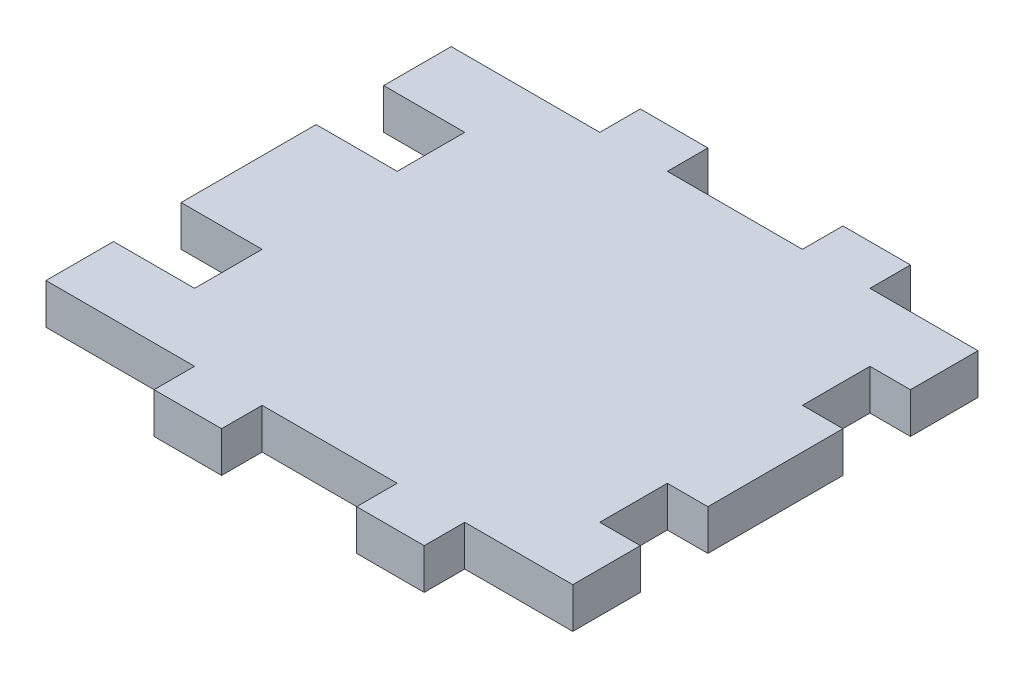
ISO-10303-21;
HEADER;
FILE_DESCRIPTION(('STEP AP214'),'2;1');
FILE_NAME('part.step','',(''),(''),'','','');
FILE_SCHEMA(('AUTOMOTIVE_DESIGN { 1 0 10303 214 1 1 1 1 }'));
ENDSEC;
DATA;
#1=APPLICATION_CONTEXT('core data for automotive mechanical design processes');
#2=APPLICATION_PROTOCOL_DEFINITION('international standard','automotive_design',2000,#1);
#3=PRODUCT_CONTEXT('',#1,'mechanical');
#4=PRODUCT('Part','Part','',(#3));
#5=PRODUCT_RELATED_PRODUCT_CATEGORY('part','',(#4));
#6=PRODUCT_DEFINITION_FORMATION('','',#4);
#7=PRODUCT_DEFINITION_CONTEXT('part definition',#1,'design');
#8=PRODUCT_DEFINITION('design','',#6,#7);
#9=PRODUCT_DEFINITION_SHAPE('','',#8);
#10=(LENGTH_UNIT() NAMED_UNIT(*) SI_UNIT(.MILLI.,.METRE.));
#11=(NAMED_UNIT(*) PLANE_ANGLE_UNIT() SI_UNIT($,.RADIAN.));
#12=(NAMED_UNIT(*) SI_UNIT($,.STERADIAN.) SOLID_ANGLE_UNIT());
#13=UNCERTAINTY_MEASURE_WITH_UNIT(LENGTH_MEASURE(1.E-05),#10,'distance_accuracy_value','');
#14=(GEOMETRIC_REPRESENTATION_CONTEXT(3) GLOBAL_UNCERTAINTY_ASSIGNED_CONTEXT((#13)) GLOBAL_UNIT_ASSIGNED_CONTEXT((#10,
#11,#12)) REPRESENTATION_CONTEXT('',''));
#15=CARTESIAN_POINT('',(0.,0.,0.));
#16=DIRECTION('',(0.,0.,1.));
#17=DIRECTION('',(1.,0.,0.));
#18=AXIS2_PLACEMENT_3D('',#15,#16,#17);
#19=CARTESIAN_POINT('',(30.,6.,0.));
#20=DIRECTION('',(1.,0.,0.));
#21=DIRECTION('',(0.,0.,-1.));
#22=AXIS2_PLACEMENT_3D('',#19,#20,#21);
#23=PLANE('',#22);
#24=DIRECTION('',(0.,0.,1.));
#25=VECTOR('',#24,1.);
#26=CARTESIAN_POINT('',(30.,0.,0.));
#27=LINE('',#26,#25);
#28=CARTESIAN_POINT('',(30.,0.,-20.));
#29=VERTEX_POINT('',#28);
#30=CARTESIAN_POINT('',(30.,0.,-10.));
#31=VERTEX_POINT('',#30);
#32=EDGE_CURVE('E300',#29,#31,#27,.T.);
#33=ORIENTED_EDGE('',*,*,#32,.F.);
#34=DIRECTION('',(0.,-1.,0.));
#35=VECTOR('',#34,1.);
#36=CARTESIAN_POINT('',(30.,6.,-20.));
#37=LINE('',#36,#35);
#38=CARTESIAN_POINT('',(30.,6.,-20.));
#39=VERTEX_POINT('',#38);
#40=EDGE_CURVE('E11',#39,#29,#37,.T.);
#41=ORIENTED_EDGE('',*,*,#40,.F.);
#42=DIRECTION('',(0.,0.,1.));
#43=VECTOR('',#42,1.);
#44=CARTESIAN_POINT('',(30.,6.,0.));
#45=LINE('',#44,#43);
#46=CARTESIAN_POINT('',(30.,6.,-10.));
#47=VERTEX_POINT('',#46);
#48=EDGE_CURVE('E387',#39,#47,#45,.T.);
#49=ORIENTED_EDGE('',*,*,#48,.T.);
#50=DIRECTION('',(0.,-1.,0.));
#51=VECTOR('',#50,1.);
#52=CARTESIAN_POINT('',(30.,6.,-10.));
#53=LINE('',#52,#51);
#54=EDGE_CURVE('E54',#47,#31,#53,.T.);
#55=ORIENTED_EDGE('',*,*,#54,.T.);
#56=EDGE_LOOP('',(#33,#41,#49,#55));
#57=FACE_BOUND('',#56,.T.);
#58=ADVANCED_FACE('F37',(#57),#23,.T.);
#59=CARTESIAN_POINT('',(0.,6.,-20.));
#60=DIRECTION('',(0.,0.,-1.));
#61=DIRECTION('',(-1.,0.,0.));
#62=AXIS2_PLACEMENT_3D('',#59,#60,#61);
#63=PLANE('',#62);
#64=DIRECTION('',(1.,0.,0.));
#65=VECTOR('',#64,1.);
#66=CARTESIAN_POINT('',(0.,0.,-20.));
#67=LINE('',#66,#65);
#68=CARTESIAN_POINT('',(36.,0.,-20.));
#69=VERTEX_POINT('',#68);
#70=EDGE_CURVE('E302',#29,#69,#67,.T.);
#71=ORIENTED_EDGE('',*,*,#70,.T.);
#72=DIRECTION('',(0.,-1.,0.));
#73=VECTOR('',#72,1.);
#74=CARTESIAN_POINT('',(36.,6.,-20.));
#75=LINE('',#74,#73);
#76=CARTESIAN_POINT('',(36.,6.,-20.));
#77=VERTEX_POINT('',#76);
#78=EDGE_CURVE('E46',#77,#69,#75,.T.);
#79=ORIENTED_EDGE('',*,*,#78,.F.);
#80=DIRECTION('',(1.,0.,0.));
#81=VECTOR('',#80,1.);
#82=CARTESIAN_POINT('',(0.,6.,-20.));
#83=LINE('',#82,#81);
#84=EDGE_CURVE('E478',#39,#77,#83,.T.);
#85=ORIENTED_EDGE('',*,*,#84,.F.);
#86=ORIENTED_EDGE('',*,*,#40,.T.);
#87=EDGE_LOOP('',(#71,#79,#85,#86));
#88=FACE_BOUND('',#87,.T.);
#89=ADVANCED_FACE('F39',(#88),#63,.F.);
#90=CARTESIAN_POINT('',(36.,6.,0.));
#91=DIRECTION('',(1.,0.,0.));
#92=DIRECTION('',(0.,0.,-1.));
#93=AXIS2_PLACEMENT_3D('',#90,#91,#92);
#94=PLANE('',#93);
#95=DIRECTION('',(0.,0.,1.));
#96=VECTOR('',#95,1.);
#97=CARTESIAN_POINT('',(36.,0.,0.));
#98=LINE('',#97,#96);
#99=CARTESIAN_POINT('',(36.,0.,-30.));
#100=VERTEX_POINT('',#99);
#101=EDGE_CURVE('E306',#100,#69,#98,.T.);
#102=ORIENTED_EDGE('',*,*,#101,.F.);
#103=DIRECTION('',(0.,-1.,0.));
#104=VECTOR('',#103,1.);
#105=CARTESIAN_POINT('',(36.,6.,-30.));
#106=LINE('',#105,#104);
#107=CARTESIAN_POINT('',(36.,6.,-30.));
#108=VERTEX_POINT('',#107);
#109=EDGE_CURVE('E457',#108,#100,#106,.T.);
#110=ORIENTED_EDGE('',*,*,#109,.F.);
#111=DIRECTION('',(0.,0.,1.));
#112=VECTOR('',#111,1.);
#113=CARTESIAN_POINT('',(36.,6.,0.));
#114=LINE('',#113,#112);
#115=EDGE_CURVE('E464',#108,#77,#114,.T.);
#116=ORIENTED_EDGE('',*,*,#115,.T.);
#117=ORIENTED_EDGE('',*,*,#78,.T.);
#118=EDGE_LOOP('',(#102,#110,#116,#117));
#119=FACE_BOUND('',#118,.T.);
#120=ADVANCED_FACE('F462',(#119),#94,.T.);
#121=CARTESIAN_POINT('',(0.,6.,-30.));
#122=DIRECTION('',(0.,0.,-1.));
#123=DIRECTION('',(-1.,0.,0.));
#124=AXIS2_PLACEMENT_3D('',#121,#122,#123);
#125=PLANE('',#124);
#126=DIRECTION('',(1.,0.,0.));
#127=VECTOR('',#126,1.);
#128=CARTESIAN_POINT('',(0.,0.,-30.));
#129=LINE('',#128,#127);
#130=CARTESIAN_POINT('',(20.0000000000002,0.,-30.));
#131=VERTEX_POINT('',#130);
#132=EDGE_CURVE('E309',#131,#100,#129,.T.);
#133=ORIENTED_EDGE('',*,*,#132,.F.);
#134=DIRECTION('',(0.,-1.,0.));
#135=VECTOR('',#134,1.);
#136=CARTESIAN_POINT('',(20.0000000000002,6.,-30.));
#137=LINE('',#136,#135);
#138=CARTESIAN_POINT('',(20.0000000000002,6.,-30.));
#139=VERTEX_POINT('',#138);
#140=EDGE_CURVE('E455',#139,#131,#137,.T.);
#141=ORIENTED_EDGE('',*,*,#140,.F.);
#142=DIRECTION('',(1.,0.,0.));
#143=VECTOR('',#142,1.);
#144=CARTESIAN_POINT('',(0.,6.,-30.));
#145=LINE('',#144,#143);
#146=EDGE_CURVE('E477',#139,#108,#145,.T.);
#147=ORIENTED_EDGE('',*,*,#146,.T.);
#148=ORIENTED_EDGE('',*,*,#109,.T.);
#149=EDGE_LOOP('',(#133,#141,#147,#148));
#150=FACE_BOUND('',#149,.T.);
#151=ADVANCED_FACE('F473',(#150),#125,.T.);
#152=CARTESIAN_POINT('',(19.9999999999992,6.,6.93889390390704E-13));
#153=DIRECTION('',(-1.,0.,0.));
#154=DIRECTION('',(0.,0.,1.));
#155=AXIS2_PLACEMENT_3D('',#152,#153,#154);
#156=PLANE('',#155);
#157=DIRECTION('',(0.,0.,-1.));
#158=VECTOR('',#157,1.);
#159=CARTESIAN_POINT('',(19.9999999999992,0.,6.93889390390704E-13));
#160=LINE('',#159,#158);
#161=CARTESIAN_POINT('',(20.0000000000004,0.,-35.9999999999998));
#162=VERTEX_POINT('',#161);
#163=EDGE_CURVE('E312',#131,#162,#160,.T.);
#164=ORIENTED_EDGE('',*,*,#163,.T.);
#165=DIRECTION('',(0.,-1.,0.));
#166=VECTOR('',#165,1.);
#167=CARTESIAN_POINT('',(20.0000000000004,6.,-35.9999999999998));
#168=LINE('',#167,#166);
#169=CARTESIAN_POINT('',(20.0000000000004,6.,-35.9999999999998));
#170=VERTEX_POINT('',#169);
#171=EDGE_CURVE('E452',#170,#162,#168,.T.);
#172=ORIENTED_EDGE('',*,*,#171,.F.);
#173=DIRECTION('',(0.,0.,-1.));
#174=VECTOR('',#173,1.);
#175=CARTESIAN_POINT('',(19.9999999999992,6.,6.93889390390704E-13));
#176=LINE('',#175,#174);
#177=EDGE_CURVE('E480',#139,#170,#176,.T.);
#178=ORIENTED_EDGE('',*,*,#177,.F.);
#179=ORIENTED_EDGE('',*,*,#140,.T.);
#180=EDGE_LOOP('',(#164,#172,#178,#179));
#181=FACE_BOUND('',#180,.T.);
#182=ADVANCED_FACE('F683',(#181),#156,.F.);
#183=CARTESIAN_POINT('',(0.,6.,-35.9999999999998));
#184=DIRECTION('',(0.,0.,1.));
#185=DIRECTION('',(1.,0.,0.));
#186=AXIS2_PLACEMENT_3D('',#183,#184,#185);
#187=PLANE('',#186);
#188=DIRECTION('',(-1.,0.,0.));
#189=VECTOR('',#188,1.);
#190=CARTESIAN_POINT('',(0.,0.,-35.9999999999998));
#191=LINE('',#190,#189);
#192=CARTESIAN_POINT('',(10.0000000000004,0.,-35.9999999999998));
#193=VERTEX_POINT('',#192);
#194=EDGE_CURVE('E316',#162,#193,#191,.T.);
#195=ORIENTED_EDGE('',*,*,#194,.T.);
#196=DIRECTION('',(0.,-1.,0.));
#197=VECTOR('',#196,1.);
#198=CARTESIAN_POINT('',(10.0000000000004,6.,-35.9999999999998));
#199=LINE('',#198,#197);
#200=CARTESIAN_POINT('',(10.0000000000004,6.,-35.9999999999998));
#201=VERTEX_POINT('',#200);
#202=EDGE_CURVE('E450',#201,#193,#199,.T.);
#203=ORIENTED_EDGE('',*,*,#202,.F.);
#204=DIRECTION('',(-1.,0.,0.));
#205=VECTOR('',#204,1.);
#206=CARTESIAN_POINT('',(0.,6.,-35.9999999999998));
#207=LINE('',#206,#205);
#208=EDGE_CURVE('E488',#170,#201,#207,.T.);
#209=ORIENTED_EDGE('',*,*,#208,.F.);
#210=ORIENTED_EDGE('',*,*,#171,.T.);
#211=EDGE_LOOP('',(#195,#203,#209,#210));
#212=FACE_BOUND('',#211,.T.);
#213=ADVANCED_FACE('F679',(#212),#187,.F.);
#214=CARTESIAN_POINT('',(9.99999999999917,6.,3.44053489402047E-13));
#215=DIRECTION('',(-1.,0.,0.));
#216=DIRECTION('',(0.,0.,1.));
#217=AXIS2_PLACEMENT_3D('',#214,#215,#216);
#218=PLANE('',#217);
#219=DIRECTION('',(0.,0.,-1.));
#220=VECTOR('',#219,1.);
#221=CARTESIAN_POINT('',(9.99999999999917,0.,3.44053489402047E-13));
#222=LINE('',#221,#220);
#223=CARTESIAN_POINT('',(10.0000000000002,0.,-30.));
#224=VERTEX_POINT('',#223);
#225=EDGE_CURVE('E319',#224,#193,#222,.T.);
#226=ORIENTED_EDGE('',*,*,#225,.F.);
#227=DIRECTION('',(0.,-1.,0.));
#228=VECTOR('',#227,1.);
#229=CARTESIAN_POINT('',(10.0000000000002,6.,-30.));
#230=LINE('',#229,#228);
#231=CARTESIAN_POINT('',(10.0000000000002,6.,-30.));
#232=VERTEX_POINT('',#231);
#233=EDGE_CURVE('E448',#232,#224,#230,.T.);
#234=ORIENTED_EDGE('',*,*,#233,.F.);
#235=DIRECTION('',(0.,0.,-1.));
#236=VECTOR('',#235,1.);
#237=CARTESIAN_POINT('',(9.99999999999917,6.,3.44053489402047E-13));
#238=LINE('',#237,#236);
#239=EDGE_CURVE('E490',#232,#201,#238,.T.);
#240=ORIENTED_EDGE('',*,*,#239,.T.);
#241=ORIENTED_EDGE('',*,*,#202,.T.);
#242=EDGE_LOOP('',(#226,#234,#240,#241));
#243=FACE_BOUND('',#242,.T.);
#244=ADVANCED_FACE('F676',(#243),#218,.T.);
#245=CARTESIAN_POINT('',(-9.99999999999969,0.,-30.));
#246=VERTEX_POINT('',#245);
#247=EDGE_CURVE('E314',#246,#224,#129,.T.);
#248=ORIENTED_EDGE('',*,*,#247,.F.);
#249=DIRECTION('',(0.,-1.,0.));
#250=VECTOR('',#249,1.);
#251=CARTESIAN_POINT('',(-9.99999999999969,6.,-30.));
#252=LINE('',#251,#250);
#253=CARTESIAN_POINT('',(-9.99999999999969,6.,-30.));
#254=VERTEX_POINT('',#253);
#255=EDGE_CURVE('E446',#254,#246,#252,.T.);
#256=ORIENTED_EDGE('',*,*,#255,.F.);
#257=EDGE_CURVE('E483',#254,#232,#145,.T.);
#258=ORIENTED_EDGE('',*,*,#257,.T.);
#259=ORIENTED_EDGE('',*,*,#233,.T.);
#260=EDGE_LOOP('',(#248,#256,#258,#259));
#261=FACE_BOUND('',#260,.T.);
#262=ADVANCED_FACE('F664',(#261),#125,.T.);
#263=CARTESIAN_POINT('',(-10.0000000000007,6.,-3.15141431469159E-13));
#264=DIRECTION('',(-1.,0.,0.));
#265=DIRECTION('',(0.,0.,1.));
#266=AXIS2_PLACEMENT_3D('',#263,#264,#265);
#267=PLANE('',#266);
#268=DIRECTION('',(0.,0.,-1.));
#269=VECTOR('',#268,1.);
#270=CARTESIAN_POINT('',(-10.0000000000007,0.,-3.15141431469159E-13));
#271=LINE('',#270,#269);
#272=CARTESIAN_POINT('',(-9.9999999999996,0.,-35.9999999999998));
#273=VERTEX_POINT('',#272);
#274=EDGE_CURVE('E322',#246,#273,#271,.T.);
#275=ORIENTED_EDGE('',*,*,#274,.T.);
#276=DIRECTION('',(0.,-1.,0.));
#277=VECTOR('',#276,1.);
#278=CARTESIAN_POINT('',(-9.9999999999996,6.,-35.9999999999998));
#279=LINE('',#278,#277);
#280=CARTESIAN_POINT('',(-9.9999999999996,6.,-35.9999999999998));
#281=VERTEX_POINT('',#280);
#282=EDGE_CURVE('E444',#281,#273,#279,.T.);
#283=ORIENTED_EDGE('',*,*,#282,.F.);
#284=DIRECTION('',(0.,0.,-1.));
#285=VECTOR('',#284,1.);
#286=CARTESIAN_POINT('',(-10.0000000000007,6.,-3.15141431469159E-13));
#287=LINE('',#286,#285);
#288=EDGE_CURVE('E493',#254,#281,#287,.T.);
#289=ORIENTED_EDGE('',*,*,#288,.F.);
#290=ORIENTED_EDGE('',*,*,#255,.T.);
#291=EDGE_LOOP('',(#275,#283,#289,#290));
#292=FACE_BOUND('',#291,.T.);
#293=ADVANCED_FACE('F671',(#292),#267,.F.);
#294=CARTESIAN_POINT('',(0.,6.,-35.9999999999998));
#295=DIRECTION('',(0.,0.,-1.));
#296=DIRECTION('',(-1.,0.,0.));
#297=AXIS2_PLACEMENT_3D('',#294,#295,#296);
#298=PLANE('',#297);
#299=DIRECTION('',(1.,0.,0.));
#300=VECTOR('',#299,1.);
#301=CARTESIAN_POINT('',(0.,0.,-35.9999999999998));
#302=LINE('',#301,#300);
#303=CARTESIAN_POINT('',(-19.9999999999996,0.,-35.9999999999998));
#304=VERTEX_POINT('',#303);
#305=EDGE_CURVE('E325',#304,#273,#302,.T.);
#306=ORIENTED_EDGE('',*,*,#305,.F.);
#307=DIRECTION('',(0.,-1.,0.));
#308=VECTOR('',#307,1.);
#309=CARTESIAN_POINT('',(-19.9999999999996,6.,-35.9999999999998));
#310=LINE('',#309,#308);
#311=CARTESIAN_POINT('',(-19.9999999999996,6.,-35.9999999999998));
#312=VERTEX_POINT('',#311);
#313=EDGE_CURVE('E442',#312,#304,#310,.T.);
#314=ORIENTED_EDGE('',*,*,#313,.F.);
#315=DIRECTION('',(1.,0.,0.));
#316=VECTOR('',#315,1.);
#317=CARTESIAN_POINT('',(0.,6.,-35.9999999999998));
#318=LINE('',#317,#316);
#319=EDGE_CURVE('E495',#312,#281,#318,.T.);
#320=ORIENTED_EDGE('',*,*,#319,.T.);
#321=ORIENTED_EDGE('',*,*,#282,.T.);
#322=EDGE_LOOP('',(#306,#314,#320,#321));
#323=FACE_BOUND('',#322,.T.);
#324=ADVANCED_FACE('F667',(#323),#298,.T.);
#325=CARTESIAN_POINT('',(-20.0000000000008,6.,-6.47630097698073E-13));
#326=DIRECTION('',(-1.,0.,0.));
#327=DIRECTION('',(0.,0.,1.));
#328=AXIS2_PLACEMENT_3D('',#325,#326,#327);
#329=PLANE('',#328);
#330=DIRECTION('',(0.,0.,-1.));
#331=VECTOR('',#330,1.);
#332=CARTESIAN_POINT('',(-20.0000000000008,0.,-6.47630097698073E-13));
#333=LINE('',#332,#331);
#334=CARTESIAN_POINT('',(-19.9999999999997,0.,-30.));
#335=VERTEX_POINT('',#334);
#336=EDGE_CURVE('E328',#335,#304,#333,.T.);
#337=ORIENTED_EDGE('',*,*,#336,.F.);
#338=DIRECTION('',(0.,-1.,0.));
#339=VECTOR('',#338,1.);
#340=CARTESIAN_POINT('',(-19.9999999999997,6.,-30.));
#341=LINE('',#340,#339);
#342=CARTESIAN_POINT('',(-19.9999999999997,6.,-30.));
#343=VERTEX_POINT('',#342);
#344=EDGE_CURVE('E440',#343,#335,#341,.T.);
#345=ORIENTED_EDGE('',*,*,#344,.F.);
#346=DIRECTION('',(0.,0.,-1.));
#347=VECTOR('',#346,1.);
#348=CARTESIAN_POINT('',(-20.0000000000008,6.,-6.47630097698073E-13));
#349=LINE('',#348,#347);
#350=EDGE_CURVE('E498',#343,#312,#349,.T.);
#351=ORIENTED_EDGE('',*,*,#350,.T.);
#352=ORIENTED_EDGE('',*,*,#313,.T.);
#353=EDGE_LOOP('',(#337,#345,#351,#352));
#354=FACE_BOUND('',#353,.T.);
#355=ADVANCED_FACE('F662',(#354),#329,.T.);
#356=CARTESIAN_POINT('',(-42.,0.,-30.));
#357=VERTEX_POINT('',#356);
#358=EDGE_CURVE('E313',#357,#335,#129,.T.);
#359=ORIENTED_EDGE('',*,*,#358,.F.);
#360=DIRECTION('',(0.,-1.,0.));
#361=VECTOR('',#360,1.);
#362=CARTESIAN_POINT('',(-42.,6.,-30.));
#363=LINE('',#362,#361);
#364=CARTESIAN_POINT('',(-42.,6.,-30.));
#365=VERTEX_POINT('',#364);
#366=EDGE_CURVE('E438',#365,#357,#363,.T.);
#367=ORIENTED_EDGE('',*,*,#366,.F.);
#368=EDGE_CURVE('E482',#365,#343,#145,.T.);
#369=ORIENTED_EDGE('',*,*,#368,.T.);
#370=ORIENTED_EDGE('',*,*,#344,.T.);
#371=EDGE_LOOP('',(#359,#367,#369,#370));
#372=FACE_BOUND('',#371,.T.);
#373=ADVANCED_FACE('F658',(#372),#125,.T.);
#374=CARTESIAN_POINT('',(-42.,6.,0.));
#375=DIRECTION('',(1.,0.,0.));
#376=DIRECTION('',(0.,0.,-1.));
#377=AXIS2_PLACEMENT_3D('',#374,#375,#376);
#378=PLANE('',#377);
#379=DIRECTION('',(0.,0.,1.));
#380=VECTOR('',#379,1.);
#381=CARTESIAN_POINT('',(-42.,0.,0.));
#382=LINE('',#381,#380);
#383=CARTESIAN_POINT('',(-42.,0.,-20.));
#384=VERTEX_POINT('',#383);
#385=EDGE_CURVE('E331',#357,#384,#382,.T.);
#386=ORIENTED_EDGE('',*,*,#385,.T.);
#387=DIRECTION('',(0.,-1.,0.));
#388=VECTOR('',#387,1.);
#389=CARTESIAN_POINT('',(-42.,6.,-20.));
#390=LINE('',#389,#388);
#391=CARTESIAN_POINT('',(-42.,6.,-20.));
#392=VERTEX_POINT('',#391);
#393=EDGE_CURVE('E436',#392,#384,#390,.T.);
#394=ORIENTED_EDGE('',*,*,#393,.F.);
#395=DIRECTION('',(0.,0.,1.));
#396=VECTOR('',#395,1.);
#397=CARTESIAN_POINT('',(-42.,6.,0.));
#398=LINE('',#397,#396);
#399=EDGE_CURVE('E501',#365,#392,#398,.T.);
#400=ORIENTED_EDGE('',*,*,#399,.F.);
#401=ORIENTED_EDGE('',*,*,#366,.T.);
#402=EDGE_LOOP('',(#386,#394,#400,#401));
#403=FACE_BOUND('',#402,.T.);
#404=ADVANCED_FACE('F654',(#403),#378,.F.);
#405=CARTESIAN_POINT('',(0.,6.,-20.0000000000001));
#406=DIRECTION('',(0.,0.,1.));
#407=DIRECTION('',(1.,0.,0.));
#408=AXIS2_PLACEMENT_3D('',#405,#406,#407);
#409=PLANE('',#408);
#410=DIRECTION('',(-1.,0.,0.));
#411=VECTOR('',#410,1.);
#412=CARTESIAN_POINT('',(0.,0.,-20.0000000000001));
#413=LINE('',#412,#411);
#414=CARTESIAN_POINT('',(-30.,0.,-20.));
#415=VERTEX_POINT('',#414);
#416=EDGE_CURVE('E334',#415,#384,#413,.T.);
#417=ORIENTED_EDGE('',*,*,#416,.F.);
#418=DIRECTION('',(0.,-1.,0.));
#419=VECTOR('',#418,1.);
#420=CARTESIAN_POINT('',(-30.,6.,-20.));
#421=LINE('',#420,#419);
#422=CARTESIAN_POINT('',(-30.,6.,-20.));
#423=VERTEX_POINT('',#422);
#424=EDGE_CURVE('E434',#423,#415,#421,.T.);
#425=ORIENTED_EDGE('',*,*,#424,.F.);
#426=DIRECTION('',(-1.,0.,0.));
#427=VECTOR('',#426,1.);
#428=CARTESIAN_POINT('',(0.,6.,-20.0000000000001));
#429=LINE('',#428,#427);
#430=EDGE_CURVE('E503',#423,#392,#429,.T.);
#431=ORIENTED_EDGE('',*,*,#430,.T.);
#432=ORIENTED_EDGE('',*,*,#393,.T.);
#433=EDGE_LOOP('',(#417,#425,#431,#432));
#434=FACE_BOUND('',#433,.T.);
#435=ADVANCED_FACE('F651',(#434),#409,.T.);
#436=CARTESIAN_POINT('',(-30.,6.,0.));
#437=DIRECTION('',(1.,0.,0.));
#438=DIRECTION('',(0.,0.,-1.));
#439=AXIS2_PLACEMENT_3D('',#436,#437,#438);
#440=PLANE('',#439);
#441=DIRECTION('',(0.,0.,1.));
#442=VECTOR('',#441,1.);
#443=CARTESIAN_POINT('',(-30.,0.,0.));
#444=LINE('',#443,#442);
#445=CARTESIAN_POINT('',(-30.,0.,-10.));
#446=VERTEX_POINT('',#445);
#447=EDGE_CURVE('E337',#415,#446,#444,.T.);
#448=ORIENTED_EDGE('',*,*,#447,.T.);
#449=DIRECTION('',(0.,-1.,0.));
#450=VECTOR('',#449,1.);
#451=CARTESIAN_POINT('',(-30.,6.,-10.));
#452=LINE('',#451,#450);
#453=CARTESIAN_POINT('',(-30.,6.,-10.));
#454=VERTEX_POINT('',#453);
#455=EDGE_CURVE('E431',#454,#446,#452,.T.);
#456=ORIENTED_EDGE('',*,*,#455,.F.);
#457=DIRECTION('',(0.,0.,1.));
#458=VECTOR('',#457,1.);
#459=CARTESIAN_POINT('',(-30.,6.,0.));
#460=LINE('',#459,#458);
#461=EDGE_CURVE('E506',#423,#454,#460,.T.);
#462=ORIENTED_EDGE('',*,*,#461,.F.);
#463=ORIENTED_EDGE('',*,*,#424,.T.);
#464=EDGE_LOOP('',(#448,#456,#462,#463));
#465=FACE_BOUND('',#464,.T.);
#466=ADVANCED_FACE('F639',(#465),#440,.F.);
#467=CARTESIAN_POINT('',(0.,6.,-10.));
#468=DIRECTION('',(0.,0.,1.));
#469=DIRECTION('',(1.,0.,0.));
#470=AXIS2_PLACEMENT_3D('',#467,#468,#469);
#471=PLANE('',#470);
#472=DIRECTION('',(-1.,0.,0.));
#473=VECTOR('',#472,1.);
#474=CARTESIAN_POINT('',(0.,0.,-10.));
#475=LINE('',#474,#473);
#476=CARTESIAN_POINT('',(-42.,0.,-10.));
#477=VERTEX_POINT('',#476);
#478=EDGE_CURVE('E339',#446,#477,#475,.T.);
#479=ORIENTED_EDGE('',*,*,#478,.T.);
#480=DIRECTION('',(0.,-1.,0.));
#481=VECTOR('',#480,1.);
#482=CARTESIAN_POINT('',(-42.,6.,-10.));
#483=LINE('',#482,#481);
#484=CARTESIAN_POINT('',(-42.,6.,-10.));
#485=VERTEX_POINT('',#484);
#486=EDGE_CURVE('E428',#485,#477,#483,.T.);
#487=ORIENTED_EDGE('',*,*,#486,.F.);
#488=DIRECTION('',(-1.,0.,0.));
#489=VECTOR('',#488,1.);
#490=CARTESIAN_POINT('',(0.,6.,-10.));
#491=LINE('',#490,#489);
#492=EDGE_CURVE('E508',#454,#485,#491,.T.);
#493=ORIENTED_EDGE('',*,*,#492,.F.);
#494=ORIENTED_EDGE('',*,*,#455,.T.);
#495=EDGE_LOOP('',(#479,#487,#493,#494));
#496=FACE_BOUND('',#495,.T.);
#497=ADVANCED_FACE('F646',(#496),#471,.F.);
#498=CARTESIAN_POINT('',(-42.,6.,0.));
#499=DIRECTION('',(1.,0.,0.));
#500=DIRECTION('',(0.,0.,-1.));
#501=AXIS2_PLACEMENT_3D('',#498,#499,#500);
#502=PLANE('',#501);
#503=DIRECTION('',(0.,0.,1.));
#504=VECTOR('',#503,1.);
#505=CARTESIAN_POINT('',(-42.,0.,0.));
#506=LINE('',#505,#504);
#507=CARTESIAN_POINT('',(-42.,0.,10.));
#508=VERTEX_POINT('',#507);
#509=EDGE_CURVE('E342',#477,#508,#506,.T.);
#510=ORIENTED_EDGE('',*,*,#509,.T.);
#511=DIRECTION('',(0.,-1.,0.));
#512=VECTOR('',#511,1.);
#513=CARTESIAN_POINT('',(-42.,6.,10.));
#514=LINE('',#513,#512);
#515=CARTESIAN_POINT('',(-42.,6.,10.));
#516=VERTEX_POINT('',#515);
#517=EDGE_CURVE('E426',#516,#508,#514,.T.);
#518=ORIENTED_EDGE('',*,*,#517,.F.);
#519=DIRECTION('',(0.,0.,1.));
#520=VECTOR('',#519,1.);
#521=CARTESIAN_POINT('',(-42.,6.,0.));
#522=LINE('',#521,#520);
#523=EDGE_CURVE('E511',#485,#516,#522,.T.);
#524=ORIENTED_EDGE('',*,*,#523,.F.);
#525=ORIENTED_EDGE('',*,*,#486,.T.);
#526=EDGE_LOOP('',(#510,#518,#524,#525));
#527=FACE_BOUND('',#526,.T.);
#528=ADVANCED_FACE('F642',(#527),#502,.F.);
#529=CARTESIAN_POINT('',(0.,6.,9.99999999999999));
#530=DIRECTION('',(0.,0.,1.));
#531=DIRECTION('',(1.,0.,0.));
#532=AXIS2_PLACEMENT_3D('',#529,#530,#531);
#533=PLANE('',#532);
#534=DIRECTION('',(-1.,0.,0.));
#535=VECTOR('',#534,1.);
#536=CARTESIAN_POINT('',(0.,0.,9.99999999999999));
#537=LINE('',#536,#535);
#538=CARTESIAN_POINT('',(-30.,0.,10.));
#539=VERTEX_POINT('',#538);
#540=EDGE_CURVE('E345',#539,#508,#537,.T.);
#541=ORIENTED_EDGE('',*,*,#540,.F.);
#542=DIRECTION('',(0.,-1.,0.));
#543=VECTOR('',#542,1.);
#544=CARTESIAN_POINT('',(-30.,6.,10.));
#545=LINE('',#544,#543);
#546=CARTESIAN_POINT('',(-30.,6.,10.));
#547=VERTEX_POINT('',#546);
#548=EDGE_CURVE('E424',#547,#539,#545,.T.);
#549=ORIENTED_EDGE('',*,*,#548,.F.);
#550=DIRECTION('',(-1.,0.,0.));
#551=VECTOR('',#550,1.);
#552=CARTESIAN_POINT('',(0.,6.,9.99999999999999));
#553=LINE('',#552,#551);
#554=EDGE_CURVE('E513',#547,#516,#553,.T.);
#555=ORIENTED_EDGE('',*,*,#554,.T.);
#556=ORIENTED_EDGE('',*,*,#517,.T.);
#557=EDGE_LOOP('',(#541,#549,#555,#556));
#558=FACE_BOUND('',#557,.T.);
#559=ADVANCED_FACE('F637',(#558),#533,.T.);
#560=CARTESIAN_POINT('',(-30.,0.,20.));
#561=VERTEX_POINT('',#560);
#562=EDGE_CURVE('E340',#539,#561,#444,.T.);
#563=ORIENTED_EDGE('',*,*,#562,.T.);
#564=DIRECTION('',(0.,-1.,0.));
#565=VECTOR('',#564,1.);
#566=CARTESIAN_POINT('',(-30.,6.,20.));
#567=LINE('',#566,#565);
#568=CARTESIAN_POINT('',(-30.,6.,20.));
#569=VERTEX_POINT('',#568);
#570=EDGE_CURVE('E421',#569,#561,#567,.T.);
#571=ORIENTED_EDGE('',*,*,#570,.F.);
#572=EDGE_CURVE('E509',#547,#569,#460,.T.);
#573=ORIENTED_EDGE('',*,*,#572,.F.);
#574=ORIENTED_EDGE('',*,*,#548,.T.);
#575=EDGE_LOOP('',(#563,#571,#573,#574));
#576=FACE_BOUND('',#575,.T.);
#577=ADVANCED_FACE('F633',(#576),#440,.F.);
#578=CARTESIAN_POINT('',(0.,6.,20.));
#579=DIRECTION('',(0.,0.,1.));
#580=DIRECTION('',(1.,0.,0.));
#581=AXIS2_PLACEMENT_3D('',#578,#579,#580);
#582=PLANE('',#581);
#583=DIRECTION('',(-1.,0.,0.));
#584=VECTOR('',#583,1.);
#585=CARTESIAN_POINT('',(0.,0.,20.));
#586=LINE('',#585,#584);
#587=CARTESIAN_POINT('',(-42.,0.,20.));
#588=VERTEX_POINT('',#587);
#589=EDGE_CURVE('E348',#561,#588,#586,.T.);
#590=ORIENTED_EDGE('',*,*,#589,.T.);
#591=DIRECTION('',(0.,-1.,0.));
#592=VECTOR('',#591,1.);
#593=CARTESIAN_POINT('',(-42.,6.,20.));
#594=LINE('',#593,#592);
#595=CARTESIAN_POINT('',(-42.,6.,20.));
#596=VERTEX_POINT('',#595);
#597=EDGE_CURVE('E419',#596,#588,#594,.T.);
#598=ORIENTED_EDGE('',*,*,#597,.F.);
#599=DIRECTION('',(-1.,0.,0.));
#600=VECTOR('',#599,1.);
#601=CARTESIAN_POINT('',(0.,6.,20.));
#602=LINE('',#601,#600);
#603=EDGE_CURVE('E516',#569,#596,#602,.T.);
#604=ORIENTED_EDGE('',*,*,#603,.F.);
#605=ORIENTED_EDGE('',*,*,#570,.T.);
#606=EDGE_LOOP('',(#590,#598,#604,#605));
#607=FACE_BOUND('',#606,.T.);
#608=ADVANCED_FACE('F629',(#607),#582,.F.);
#609=CARTESIAN_POINT('',(-42.,6.,0.));
#610=DIRECTION('',(-1.,0.,0.));
#611=DIRECTION('',(0.,0.,1.));
#612=AXIS2_PLACEMENT_3D('',#609,#610,#611);
#613=PLANE('',#612);
#614=DIRECTION('',(0.,0.,-1.));
#615=VECTOR('',#614,1.);
#616=CARTESIAN_POINT('',(-42.,0.,0.));
#617=LINE('',#616,#615);
#618=CARTESIAN_POINT('',(-42.,0.,30.));
#619=VERTEX_POINT('',#618);
#620=EDGE_CURVE('E351',#619,#588,#617,.T.);
#621=ORIENTED_EDGE('',*,*,#620,.F.);
#622=DIRECTION('',(0.,-1.,0.));
#623=VECTOR('',#622,1.);
#624=CARTESIAN_POINT('',(-42.,6.,30.));
#625=LINE('',#624,#623);
#626=CARTESIAN_POINT('',(-42.,6.,30.));
#627=VERTEX_POINT('',#626);
#628=EDGE_CURVE('E417',#627,#619,#625,.T.);
#629=ORIENTED_EDGE('',*,*,#628,.F.);
#630=DIRECTION('',(0.,0.,-1.));
#631=VECTOR('',#630,1.);
#632=CARTESIAN_POINT('',(-42.,6.,0.));
#633=LINE('',#632,#631);
#634=EDGE_CURVE('E518',#627,#596,#633,.T.);
#635=ORIENTED_EDGE('',*,*,#634,.T.);
#636=ORIENTED_EDGE('',*,*,#597,.T.);
#637=EDGE_LOOP('',(#621,#629,#635,#636));
#638=FACE_BOUND('',#637,.T.);
#639=ADVANCED_FACE('F626',(#638),#613,.T.);
#640=CARTESIAN_POINT('',(0.,6.,30.));
#641=DIRECTION('',(0.,0.,-1.));
#642=DIRECTION('',(-1.,0.,0.));
#643=AXIS2_PLACEMENT_3D('',#640,#641,#642);
#644=PLANE('',#643);
#645=DIRECTION('',(1.,0.,0.));
#646=VECTOR('',#645,1.);
#647=CARTESIAN_POINT('',(0.,0.,30.));
#648=LINE('',#647,#646);
#649=CARTESIAN_POINT('',(-20.,0.,30.));
#650=VERTEX_POINT('',#649);
#651=EDGE_CURVE('E354',#619,#650,#648,.T.);
#652=ORIENTED_EDGE('',*,*,#651,.T.);
#653=DIRECTION('',(0.,-1.,0.));
#654=VECTOR('',#653,1.);
#655=CARTESIAN_POINT('',(-20.,6.,30.));
#656=LINE('',#655,#654);
#657=CARTESIAN_POINT('',(-20.,6.,30.));
#658=VERTEX_POINT('',#657);
#659=EDGE_CURVE('E414',#658,#650,#656,.T.);
#660=ORIENTED_EDGE('',*,*,#659,.F.);
#661=DIRECTION('',(1.,0.,0.));
#662=VECTOR('',#661,1.);
#663=CARTESIAN_POINT('',(0.,6.,30.));
#664=LINE('',#663,#662);
#665=EDGE_CURVE('E521',#627,#658,#664,.T.);
#666=ORIENTED_EDGE('',*,*,#665,.F.);
#667=ORIENTED_EDGE('',*,*,#628,.T.);
#668=EDGE_LOOP('',(#652,#660,#666,#667));
#669=FACE_BOUND('',#668,.T.);
#670=ADVANCED_FACE('F608',(#669),#644,.F.);
#671=CARTESIAN_POINT('',(-20.,6.,0.));
#672=DIRECTION('',(1.,0.,0.));
#673=DIRECTION('',(0.,0.,-1.));
#674=AXIS2_PLACEMENT_3D('',#671,#672,#673);
#675=PLANE('',#674);
#676=DIRECTION('',(0.,0.,1.));
#677=VECTOR('',#676,1.);
#678=CARTESIAN_POINT('',(-20.,0.,0.));
#679=LINE('',#678,#677);
#680=CARTESIAN_POINT('',(-20.,0.,36.));
#681=VERTEX_POINT('',#680);
#682=EDGE_CURVE('E356',#650,#681,#679,.T.);
#683=ORIENTED_EDGE('',*,*,#682,.T.);
#684=DIRECTION('',(0.,-1.,0.));
#685=VECTOR('',#684,1.);
#686=CARTESIAN_POINT('',(-20.,6.,36.));
#687=LINE('',#686,#685);
#688=CARTESIAN_POINT('',(-20.,6.,36.));
#689=VERTEX_POINT('',#688);
#690=EDGE_CURVE('E411',#689,#681,#687,.T.);
#691=ORIENTED_EDGE('',*,*,#690,.F.);
#692=DIRECTION('',(0.,0.,1.));
#693=VECTOR('',#692,1.);
#694=CARTESIAN_POINT('',(-20.,6.,0.));
#695=LINE('',#694,#693);
#696=EDGE_CURVE('E523',#658,#689,#695,.T.);
#697=ORIENTED_EDGE('',*,*,#696,.F.);
#698=ORIENTED_EDGE('',*,*,#659,.T.);
#699=EDGE_LOOP('',(#683,#691,#697,#698));
#700=FACE_BOUND('',#699,.T.);
#701=ADVANCED_FACE('F621',(#700),#675,.F.);
#702=CARTESIAN_POINT('',(0.,6.,36.));
#703=DIRECTION('',(0.,0.,-1.));
#704=DIRECTION('',(-1.,0.,0.));
#705=AXIS2_PLACEMENT_3D('',#702,#703,#704);
#706=PLANE('',#705);
#707=DIRECTION('',(1.,0.,0.));
#708=VECTOR('',#707,1.);
#709=CARTESIAN_POINT('',(0.,0.,36.));
#710=LINE('',#709,#708);
#711=CARTESIAN_POINT('',(-9.99999999999999,0.,36.));
#712=VERTEX_POINT('',#711);
#713=EDGE_CURVE('E360',#681,#712,#710,.T.);
#714=ORIENTED_EDGE('',*,*,#713,.T.);
#715=DIRECTION('',(0.,-1.,0.));
#716=VECTOR('',#715,1.);
#717=CARTESIAN_POINT('',(-9.99999999999999,6.,36.));
#718=LINE('',#717,#716);
#719=CARTESIAN_POINT('',(-9.99999999999999,6.,36.));
#720=VERTEX_POINT('',#719);
#721=EDGE_CURVE('E409',#720,#712,#718,.T.);
#722=ORIENTED_EDGE('',*,*,#721,.F.);
#723=DIRECTION('',(1.,0.,0.));
#724=VECTOR('',#723,1.);
#725=CARTESIAN_POINT('',(0.,6.,36.));
#726=LINE('',#725,#724);
#727=EDGE_CURVE('E527',#689,#720,#726,.T.);
#728=ORIENTED_EDGE('',*,*,#727,.F.);
#729=ORIENTED_EDGE('',*,*,#690,.T.);
#730=EDGE_LOOP('',(#714,#722,#728,#729));
#731=FACE_BOUND('',#730,.T.);
#732=ADVANCED_FACE('F617',(#731),#706,.F.);
#733=CARTESIAN_POINT('',(-9.99999999999999,6.,0.));
#734=DIRECTION('',(1.,0.,0.));
#735=DIRECTION('',(0.,0.,-1.));
#736=AXIS2_PLACEMENT_3D('',#733,#734,#735);
#737=PLANE('',#736);
#738=DIRECTION('',(0.,0.,1.));
#739=VECTOR('',#738,1.);
#740=CARTESIAN_POINT('',(-9.99999999999999,0.,0.));
#741=LINE('',#740,#739);
#742=CARTESIAN_POINT('',(-9.99999999999999,0.,30.));
#743=VERTEX_POINT('',#742);
#744=EDGE_CURVE('E363',#743,#712,#741,.T.);
#745=ORIENTED_EDGE('',*,*,#744,.F.);
#746=DIRECTION('',(0.,-1.,0.));
#747=VECTOR('',#746,1.);
#748=CARTESIAN_POINT('',(-9.99999999999999,6.,30.));
#749=LINE('',#748,#747);
#750=CARTESIAN_POINT('',(-9.99999999999999,6.,30.));
#751=VERTEX_POINT('',#750);
#752=EDGE_CURVE('E407',#751,#743,#749,.T.);
#753=ORIENTED_EDGE('',*,*,#752,.F.);
#754=DIRECTION('',(0.,0.,1.));
#755=VECTOR('',#754,1.);
#756=CARTESIAN_POINT('',(-9.99999999999999,6.,0.));
#757=LINE('',#756,#755);
#758=EDGE_CURVE('E529',#751,#720,#757,.T.);
#759=ORIENTED_EDGE('',*,*,#758,.T.);
#760=ORIENTED_EDGE('',*,*,#721,.T.);
#761=EDGE_LOOP('',(#745,#753,#759,#760));
#762=FACE_BOUND('',#761,.T.);
#763=ADVANCED_FACE('F614',(#762),#737,.T.);
#764=CARTESIAN_POINT('',(10.,0.,30.));
#765=VERTEX_POINT('',#764);
#766=EDGE_CURVE('E358',#743,#765,#648,.T.);
#767=ORIENTED_EDGE('',*,*,#766,.T.);
#768=DIRECTION('',(0.,-1.,0.));
#769=VECTOR('',#768,1.);
#770=CARTESIAN_POINT('',(10.,6.,30.));
#771=LINE('',#770,#769);
#772=CARTESIAN_POINT('',(10.,6.,30.));
#773=VERTEX_POINT('',#772);
#774=EDGE_CURVE('E404',#773,#765,#771,.T.);
#775=ORIENTED_EDGE('',*,*,#774,.F.);
#776=EDGE_CURVE('E525',#751,#773,#664,.T.);
#777=ORIENTED_EDGE('',*,*,#776,.F.);
#778=ORIENTED_EDGE('',*,*,#752,.T.);
#779=EDGE_LOOP('',(#767,#775,#777,#778));
#780=FACE_BOUND('',#779,.T.);
#781=ADVANCED_FACE('F587',(#780),#644,.F.);
#782=CARTESIAN_POINT('',(9.99999999999991,6.,0.));
#783=DIRECTION('',(1.,0.,0.));
#784=DIRECTION('',(0.,0.,-1.));
#785=AXIS2_PLACEMENT_3D('',#782,#783,#784);
#786=PLANE('',#785);
#787=DIRECTION('',(0.,0.,1.));
#788=VECTOR('',#787,1.);
#789=CARTESIAN_POINT('',(9.99999999999991,0.,0.));
#790=LINE('',#789,#788);
#791=CARTESIAN_POINT('',(10.,0.,36.));
#792=VERTEX_POINT('',#791);
#793=EDGE_CURVE('E366',#765,#792,#790,.T.);
#794=ORIENTED_EDGE('',*,*,#793,.T.);
#795=DIRECTION('',(0.,-1.,0.));
#796=VECTOR('',#795,1.);
#797=CARTESIAN_POINT('',(10.,6.,36.));
#798=LINE('',#797,#796);
#799=CARTESIAN_POINT('',(10.,6.,36.));
#800=VERTEX_POINT('',#799);
#801=EDGE_CURVE('E402',#800,#792,#798,.T.);
#802=ORIENTED_EDGE('',*,*,#801,.F.);
#803=DIRECTION('',(0.,0.,1.));
#804=VECTOR('',#803,1.);
#805=CARTESIAN_POINT('',(9.99999999999991,6.,0.));
#806=LINE('',#805,#804);
#807=EDGE_CURVE('E532',#773,#800,#806,.T.);
#808=ORIENTED_EDGE('',*,*,#807,.F.);
#809=ORIENTED_EDGE('',*,*,#774,.T.);
#810=EDGE_LOOP('',(#794,#802,#808,#809));
#811=FACE_BOUND('',#810,.T.);
#812=ADVANCED_FACE('F593',(#811),#786,.F.);
#813=CARTESIAN_POINT('',(0.,6.,36.));
#814=DIRECTION('',(0.,0.,1.));
#815=DIRECTION('',(1.,0.,0.));
#816=AXIS2_PLACEMENT_3D('',#813,#814,#815);
#817=PLANE('',#816);
#818=DIRECTION('',(-1.,0.,0.));
#819=VECTOR('',#818,1.);
#820=CARTESIAN_POINT('',(0.,0.,36.));
#821=LINE('',#820,#819);
#822=CARTESIAN_POINT('',(20.,0.,36.));
#823=VERTEX_POINT('',#822);
#824=EDGE_CURVE('E369',#823,#792,#821,.T.);
#825=ORIENTED_EDGE('',*,*,#824,.F.);
#826=DIRECTION('',(0.,-1.,0.));
#827=VECTOR('',#826,1.);
#828=CARTESIAN_POINT('',(20.,6.,36.));
#829=LINE('',#828,#827);
#830=CARTESIAN_POINT('',(20.,6.,36.));
#831=VERTEX_POINT('',#830);
#832=EDGE_CURVE('E400',#831,#823,#829,.T.);
#833=ORIENTED_EDGE('',*,*,#832,.F.);
#834=DIRECTION('',(-1.,0.,0.));
#835=VECTOR('',#834,1.);
#836=CARTESIAN_POINT('',(0.,6.,36.));
#837=LINE('',#836,#835);
#838=EDGE_CURVE('E534',#831,#800,#837,.T.);
#839=ORIENTED_EDGE('',*,*,#838,.T.);
#840=ORIENTED_EDGE('',*,*,#801,.T.);
#841=EDGE_LOOP('',(#825,#833,#839,#840));
#842=FACE_BOUND('',#841,.T.);
#843=ADVANCED_FACE('F597',(#842),#817,.T.);
#844=CARTESIAN_POINT('',(19.9999999999999,6.,0.));
#845=DIRECTION('',(1.,0.,0.));
#846=DIRECTION('',(0.,0.,-1.));
#847=AXIS2_PLACEMENT_3D('',#844,#845,#846);
#848=PLANE('',#847);
#849=DIRECTION('',(0.,0.,1.));
#850=VECTOR('',#849,1.);
#851=CARTESIAN_POINT('',(19.9999999999999,0.,0.));
#852=LINE('',#851,#850);
#853=CARTESIAN_POINT('',(20.,0.,30.));
#854=VERTEX_POINT('',#853);
#855=EDGE_CURVE('E372',#854,#823,#852,.T.);
#856=ORIENTED_EDGE('',*,*,#855,.F.);
#857=DIRECTION('',(0.,-1.,0.));
#858=VECTOR('',#857,1.);
#859=CARTESIAN_POINT('',(20.,6.,30.));
#860=LINE('',#859,#858);
#861=CARTESIAN_POINT('',(20.,6.,30.));
#862=VERTEX_POINT('',#861);
#863=EDGE_CURVE('E398',#862,#854,#860,.T.);
#864=ORIENTED_EDGE('',*,*,#863,.F.);
#865=DIRECTION('',(0.,0.,1.));
#866=VECTOR('',#865,1.);
#867=CARTESIAN_POINT('',(19.9999999999999,6.,0.));
#868=LINE('',#867,#866);
#869=EDGE_CURVE('E537',#862,#831,#868,.T.);
#870=ORIENTED_EDGE('',*,*,#869,.T.);
#871=ORIENTED_EDGE('',*,*,#832,.T.);
#872=EDGE_LOOP('',(#856,#864,#870,#871));
#873=FACE_BOUND('',#872,.T.);
#874=ADVANCED_FACE('F600',(#873),#848,.T.);
#875=CARTESIAN_POINT('',(36.,0.,30.));
#876=VERTEX_POINT('',#875);
#877=EDGE_CURVE('E357',#854,#876,#648,.T.);
#878=ORIENTED_EDGE('',*,*,#877,.T.);
#879=DIRECTION('',(0.,-1.,0.));
#880=VECTOR('',#879,1.);
#881=CARTESIAN_POINT('',(36.,6.,30.));
#882=LINE('',#881,#880);
#883=CARTESIAN_POINT('',(36.,6.,30.));
#884=VERTEX_POINT('',#883);
#885=EDGE_CURVE('E395',#884,#876,#882,.T.);
#886=ORIENTED_EDGE('',*,*,#885,.F.);
#887=EDGE_CURVE('E524',#862,#884,#664,.T.);
#888=ORIENTED_EDGE('',*,*,#887,.F.);
#889=ORIENTED_EDGE('',*,*,#863,.T.);
#890=EDGE_LOOP('',(#878,#886,#888,#889));
#891=FACE_BOUND('',#890,.T.);
#892=ADVANCED_FACE('F581',(#891),#644,.F.);
#893=CARTESIAN_POINT('',(36.,6.,0.));
#894=DIRECTION('',(-1.,0.,0.));
#895=DIRECTION('',(0.,0.,1.));
#896=AXIS2_PLACEMENT_3D('',#893,#894,#895);
#897=PLANE('',#896);
#898=DIRECTION('',(0.,0.,-1.));
#899=VECTOR('',#898,1.);
#900=CARTESIAN_POINT('',(36.,0.,0.));
#901=LINE('',#900,#899);
#902=CARTESIAN_POINT('',(36.,0.,20.));
#903=VERTEX_POINT('',#902);
#904=EDGE_CURVE('E375',#876,#903,#901,.T.);
#905=ORIENTED_EDGE('',*,*,#904,.T.);
#906=DIRECTION('',(0.,-1.,0.));
#907=VECTOR('',#906,1.);
#908=CARTESIAN_POINT('',(36.,6.,20.));
#909=LINE('',#908,#907);
#910=CARTESIAN_POINT('',(36.,6.,20.));
#911=VERTEX_POINT('',#910);
#912=EDGE_CURVE('E393',#911,#903,#909,.T.);
#913=ORIENTED_EDGE('',*,*,#912,.F.);
#914=DIRECTION('',(0.,0.,-1.));
#915=VECTOR('',#914,1.);
#916=CARTESIAN_POINT('',(36.,6.,0.));
#917=LINE('',#916,#915);
#918=EDGE_CURVE('E540',#884,#911,#917,.T.);
#919=ORIENTED_EDGE('',*,*,#918,.F.);
#920=ORIENTED_EDGE('',*,*,#885,.T.);
#921=EDGE_LOOP('',(#905,#913,#919,#920));
#922=FACE_BOUND('',#921,.T.);
#923=ADVANCED_FACE('F569',(#922),#897,.F.);
#924=CARTESIAN_POINT('',(0.,6.,20.));
#925=DIRECTION('',(0.,0.,-1.));
#926=DIRECTION('',(-1.,0.,0.));
#927=AXIS2_PLACEMENT_3D('',#924,#925,#926);
#928=PLANE('',#927);
#929=DIRECTION('',(1.,0.,0.));
#930=VECTOR('',#929,1.);
#931=CARTESIAN_POINT('',(0.,0.,20.));
#932=LINE('',#931,#930);
#933=CARTESIAN_POINT('',(30.,0.,20.));
#934=VERTEX_POINT('',#933);
#935=EDGE_CURVE('E378',#934,#903,#932,.T.);
#936=ORIENTED_EDGE('',*,*,#935,.F.);
#937=DIRECTION('',(0.,-1.,0.));
#938=VECTOR('',#937,1.);
#939=CARTESIAN_POINT('',(30.,6.,20.));
#940=LINE('',#939,#938);
#941=CARTESIAN_POINT('',(30.,6.,20.));
#942=VERTEX_POINT('',#941);
#943=EDGE_CURVE('E391',#942,#934,#940,.T.);
#944=ORIENTED_EDGE('',*,*,#943,.F.);
#945=DIRECTION('',(1.,0.,0.));
#946=VECTOR('',#945,1.);
#947=CARTESIAN_POINT('',(0.,6.,20.));
#948=LINE('',#947,#946);
#949=EDGE_CURVE('E541',#942,#911,#948,.T.);
#950=ORIENTED_EDGE('',*,*,#949,.T.);
#951=ORIENTED_EDGE('',*,*,#912,.T.);
#952=EDGE_LOOP('',(#936,#944,#950,#951));
#953=FACE_BOUND('',#952,.T.);
#954=ADVANCED_FACE('F564',(#953),#928,.T.);
#955=CARTESIAN_POINT('',(30.,0.,10.));
#956=VERTEX_POINT('',#955);
#957=EDGE_CURVE('E303',#956,#934,#27,.T.);
#958=ORIENTED_EDGE('',*,*,#957,.F.);
#959=DIRECTION('',(0.,-1.,0.));
#960=VECTOR('',#959,1.);
#961=CARTESIAN_POINT('',(30.,6.,10.));
#962=LINE('',#961,#960);
#963=CARTESIAN_POINT('',(30.,6.,10.));
#964=VERTEX_POINT('',#963);
#965=EDGE_CURVE('E292',#964,#956,#962,.T.);
#966=ORIENTED_EDGE('',*,*,#965,.F.);
#967=EDGE_CURVE('E282',#964,#942,#45,.T.);
#968=ORIENTED_EDGE('',*,*,#967,.T.);
#969=ORIENTED_EDGE('',*,*,#943,.T.);
#970=EDGE_LOOP('',(#958,#966,#968,#969));
#971=FACE_BOUND('',#970,.T.);
#972=ADVANCED_FACE('F557',(#971),#23,.T.);
#973=CARTESIAN_POINT('',(0.,6.,10.));
#974=DIRECTION('',(0.,0.,-1.));
#975=DIRECTION('',(-1.,0.,0.));
#976=AXIS2_PLACEMENT_3D('',#973,#974,#975);
#977=PLANE('',#976);
#978=DIRECTION('',(1.,0.,0.));
#979=VECTOR('',#978,1.);
#980=CARTESIAN_POINT('',(0.,0.,10.));
#981=LINE('',#980,#979);
#982=CARTESIAN_POINT('',(36.,0.,10.));
#983=VERTEX_POINT('',#982);
#984=EDGE_CURVE('E289',#956,#983,#981,.T.);
#985=ORIENTED_EDGE('',*,*,#984,.T.);
#986=DIRECTION('',(0.,-1.,0.));
#987=VECTOR('',#986,1.);
#988=CARTESIAN_POINT('',(36.,6.,10.));
#989=LINE('',#988,#987);
#990=CARTESIAN_POINT('',(36.,6.,10.));
#991=VERTEX_POINT('',#990);
#992=EDGE_CURVE('E286',#991,#983,#989,.T.);
#993=ORIENTED_EDGE('',*,*,#992,.F.);
#994=DIRECTION('',(1.,0.,0.));
#995=VECTOR('',#994,1.);
#996=CARTESIAN_POINT('',(0.,6.,10.));
#997=LINE('',#996,#995);
#998=EDGE_CURVE('E273',#964,#991,#997,.T.);
#999=ORIENTED_EDGE('',*,*,#998,.F.);
#1000=ORIENTED_EDGE('',*,*,#965,.T.);
#1001=EDGE_LOOP('',(#985,#993,#999,#1000));
#1002=FACE_BOUND('',#1001,.T.);
#1003=ADVANCED_FACE('F287',(#1002),#977,.F.);
#1004=CARTESIAN_POINT('',(36.,6.,0.));
#1005=DIRECTION('',(-1.,0.,0.));
#1006=DIRECTION('',(0.,0.,1.));
#1007=AXIS2_PLACEMENT_3D('',#1004,#1005,#1006);
#1008=PLANE('',#1007);
#1009=DIRECTION('',(0.,0.,-1.));
#1010=VECTOR('',#1009,1.);
#1011=CARTESIAN_POINT('',(36.,0.,0.));
#1012=LINE('',#1011,#1010);
#1013=CARTESIAN_POINT('',(36.,0.,-10.));
#1014=VERTEX_POINT('',#1013);
#1015=EDGE_CURVE('E382',#983,#1014,#1012,.T.);
#1016=ORIENTED_EDGE('',*,*,#1015,.T.);
#1017=DIRECTION('',(0.,-1.,0.));
#1018=VECTOR('',#1017,1.);
#1019=CARTESIAN_POINT('',(36.,6.,-10.));
#1020=LINE('',#1019,#1018);
#1021=CARTESIAN_POINT('',(36.,6.,-10.));
#1022=VERTEX_POINT('',#1021);
#1023=EDGE_CURVE('E164',#1022,#1014,#1020,.T.);
#1024=ORIENTED_EDGE('',*,*,#1023,.F.);
#1025=DIRECTION('',(0.,0.,-1.));
#1026=VECTOR('',#1025,1.);
#1027=CARTESIAN_POINT('',(36.,6.,0.));
#1028=LINE('',#1027,#1026);
#1029=EDGE_CURVE('E279',#991,#1022,#1028,.T.);
#1030=ORIENTED_EDGE('',*,*,#1029,.F.);
#1031=ORIENTED_EDGE('',*,*,#992,.T.);
#1032=EDGE_LOOP('',(#1016,#1024,#1030,#1031));
#1033=FACE_BOUND('',#1032,.T.);
#1034=ADVANCED_FACE('F294',(#1033),#1008,.F.);
#1035=CARTESIAN_POINT('',(0.,6.,-10.));
#1036=DIRECTION('',(0.,0.,-1.));
#1037=DIRECTION('',(-1.,0.,0.));
#1038=AXIS2_PLACEMENT_3D('',#1035,#1036,#1037);
#1039=PLANE('',#1038);
#1040=DIRECTION('',(1.,0.,0.));
#1041=VECTOR('',#1040,1.);
#1042=CARTESIAN_POINT('',(0.,0.,-10.));
#1043=LINE('',#1042,#1041);
#1044=EDGE_CURVE('E384',#31,#1014,#1043,.T.);
#1045=ORIENTED_EDGE('',*,*,#1044,.F.);
#1046=ORIENTED_EDGE('',*,*,#54,.F.);
#1047=DIRECTION('',(1.,0.,0.));
#1048=VECTOR('',#1047,1.);
#1049=CARTESIAN_POINT('',(0.,6.,-10.));
#1050=LINE('',#1049,#1048);
#1051=EDGE_CURVE('E295',#47,#1022,#1050,.T.);
#1052=ORIENTED_EDGE('',*,*,#1051,.T.);
#1053=ORIENTED_EDGE('',*,*,#1023,.T.);
#1054=EDGE_LOOP('',(#1045,#1046,#1052,#1053));
#1055=FACE_BOUND('',#1054,.T.);
#1056=ADVANCED_FACE('F545',(#1055),#1039,.T.);
#1057=CARTESIAN_POINT('',(0.,6.,0.));
#1058=DIRECTION('',(0.,1.,0.));
#1059=DIRECTION('',(0.,0.,1.));
#1060=AXIS2_PLACEMENT_3D('',#1057,#1058,#1059);
#1061=PLANE('',#1060);
#1062=ORIENTED_EDGE('',*,*,#48,.F.);
#1063=ORIENTED_EDGE('',*,*,#84,.T.);
#1064=ORIENTED_EDGE('',*,*,#115,.F.);
#1065=ORIENTED_EDGE('',*,*,#146,.F.);
#1066=ORIENTED_EDGE('',*,*,#177,.T.);
#1067=ORIENTED_EDGE('',*,*,#208,.T.);
#1068=ORIENTED_EDGE('',*,*,#239,.F.);
#1069=ORIENTED_EDGE('',*,*,#257,.F.);
#1070=ORIENTED_EDGE('',*,*,#288,.T.);
#1071=ORIENTED_EDGE('',*,*,#319,.F.);
#1072=ORIENTED_EDGE('',*,*,#350,.F.);
#1073=ORIENTED_EDGE('',*,*,#368,.F.);
#1074=ORIENTED_EDGE('',*,*,#399,.T.);
#1075=ORIENTED_EDGE('',*,*,#430,.F.);
#1076=ORIENTED_EDGE('',*,*,#461,.T.);
#1077=ORIENTED_EDGE('',*,*,#492,.T.);
#1078=ORIENTED_EDGE('',*,*,#523,.T.);
#1079=ORIENTED_EDGE('',*,*,#554,.F.);
#1080=ORIENTED_EDGE('',*,*,#572,.T.);
#1081=ORIENTED_EDGE('',*,*,#603,.T.);
#1082=ORIENTED_EDGE('',*,*,#634,.F.);
#1083=ORIENTED_EDGE('',*,*,#665,.T.);
#1084=ORIENTED_EDGE('',*,*,#696,.T.);
#1085=ORIENTED_EDGE('',*,*,#727,.T.);
#1086=ORIENTED_EDGE('',*,*,#758,.F.);
#1087=ORIENTED_EDGE('',*,*,#776,.T.);
#1088=ORIENTED_EDGE('',*,*,#807,.T.);
#1089=ORIENTED_EDGE('',*,*,#838,.F.);
#1090=ORIENTED_EDGE('',*,*,#869,.F.);
#1091=ORIENTED_EDGE('',*,*,#887,.T.);
#1092=ORIENTED_EDGE('',*,*,#918,.T.);
#1093=ORIENTED_EDGE('',*,*,#949,.F.);
#1094=ORIENTED_EDGE('',*,*,#967,.F.);
#1095=ORIENTED_EDGE('',*,*,#998,.T.);
#1096=ORIENTED_EDGE('',*,*,#1029,.T.);
#1097=ORIENTED_EDGE('',*,*,#1051,.F.);
#1098=EDGE_LOOP('',(#1062,#1063,#1064,#1065,#1066,#1067,#1068,#1069,#1070,#1071,#1072,#1073,
#1074,#1075,#1076,#1077,#1078,#1079,#1080,#1081,#1082,#1083,#1084,#1085,#1086,#1087,#1088,#1089,
#1090,#1091,#1092,#1093,#1094,#1095,#1096,#1097));
#1099=FACE_BOUND('',#1098,.T.);
#1100=ADVANCED_FACE('F276',(#1099),#1061,.T.);
#1101=CARTESIAN_POINT('',(0.,0.,0.));
#1102=DIRECTION('',(0.,1.,0.));
#1103=DIRECTION('',(0.,0.,1.));
#1104=AXIS2_PLACEMENT_3D('',#1101,#1102,#1103);
#1105=PLANE('',#1104);
#1106=ORIENTED_EDGE('',*,*,#32,.T.);
#1107=ORIENTED_EDGE('',*,*,#1044,.T.);
#1108=ORIENTED_EDGE('',*,*,#1015,.F.);
#1109=ORIENTED_EDGE('',*,*,#984,.F.);
#1110=ORIENTED_EDGE('',*,*,#957,.T.);
#1111=ORIENTED_EDGE('',*,*,#935,.T.);
#1112=ORIENTED_EDGE('',*,*,#904,.F.);
#1113=ORIENTED_EDGE('',*,*,#877,.F.);
#1114=ORIENTED_EDGE('',*,*,#855,.T.);
#1115=ORIENTED_EDGE('',*,*,#824,.T.);
#1116=ORIENTED_EDGE('',*,*,#793,.F.);
#1117=ORIENTED_EDGE('',*,*,#766,.F.);
#1118=ORIENTED_EDGE('',*,*,#744,.T.);
#1119=ORIENTED_EDGE('',*,*,#713,.F.);
#1120=ORIENTED_EDGE('',*,*,#682,.F.);
#1121=ORIENTED_EDGE('',*,*,#651,.F.);
#1122=ORIENTED_EDGE('',*,*,#620,.T.);
#1123=ORIENTED_EDGE('',*,*,#589,.F.);
#1124=ORIENTED_EDGE('',*,*,#562,.F.);
#1125=ORIENTED_EDGE('',*,*,#540,.T.);
#1126=ORIENTED_EDGE('',*,*,#509,.F.);
#1127=ORIENTED_EDGE('',*,*,#478,.F.);
#1128=ORIENTED_EDGE('',*,*,#447,.F.);
#1129=ORIENTED_EDGE('',*,*,#416,.T.);
#1130=ORIENTED_EDGE('',*,*,#385,.F.);
#1131=ORIENTED_EDGE('',*,*,#358,.T.);
#1132=ORIENTED_EDGE('',*,*,#336,.T.);
#1133=ORIENTED_EDGE('',*,*,#305,.T.);
#1134=ORIENTED_EDGE('',*,*,#274,.F.);
#1135=ORIENTED_EDGE('',*,*,#247,.T.);
#1136=ORIENTED_EDGE('',*,*,#225,.T.);
#1137=ORIENTED_EDGE('',*,*,#194,.F.);
#1138=ORIENTED_EDGE('',*,*,#163,.F.);
#1139=ORIENTED_EDGE('',*,*,#132,.T.);
#1140=ORIENTED_EDGE('',*,*,#101,.T.);
#1141=ORIENTED_EDGE('',*,*,#70,.F.);
#1142=EDGE_LOOP('',(#1106,#1107,#1108,#1109,#1110,#1111,#1112,#1113,#1114,#1115,#1116,#1117,
#1118,#1119,#1120,#1121,#1122,#1123,#1124,#1125,#1126,#1127,#1128,#1129,#1130,#1131,#1132,#1133,
#1134,#1135,#1136,#1137,#1138,#1139,#1140,#1141));
#1143=FACE_BOUND('',#1142,.T.);
#1144=ADVANCED_FACE('F468',(#1143),#1105,.F.);
#1145=CLOSED_SHELL('',(#58,#89,#120,#151,#182,#213,#244,#262,#293,#324,#355,#373,#404,#435,#466,
#497,#528,#559,#577,#608,#639,#670,#701,#732,#763,#781,#812,#843,#874,#892,#923,#954,#972,#1003,
#1034,#1056,#1100,#1144));
#1146=MANIFOLD_SOLID_BREP('B2',#1145);
#1147=ADVANCED_BREP_SHAPE_REPRESENTATION('',(#18,#1146),#14);
#1148=SHAPE_DEFINITION_REPRESENTATION(#9,#1147);
ENDSEC;
END-ISO-10303-21;
